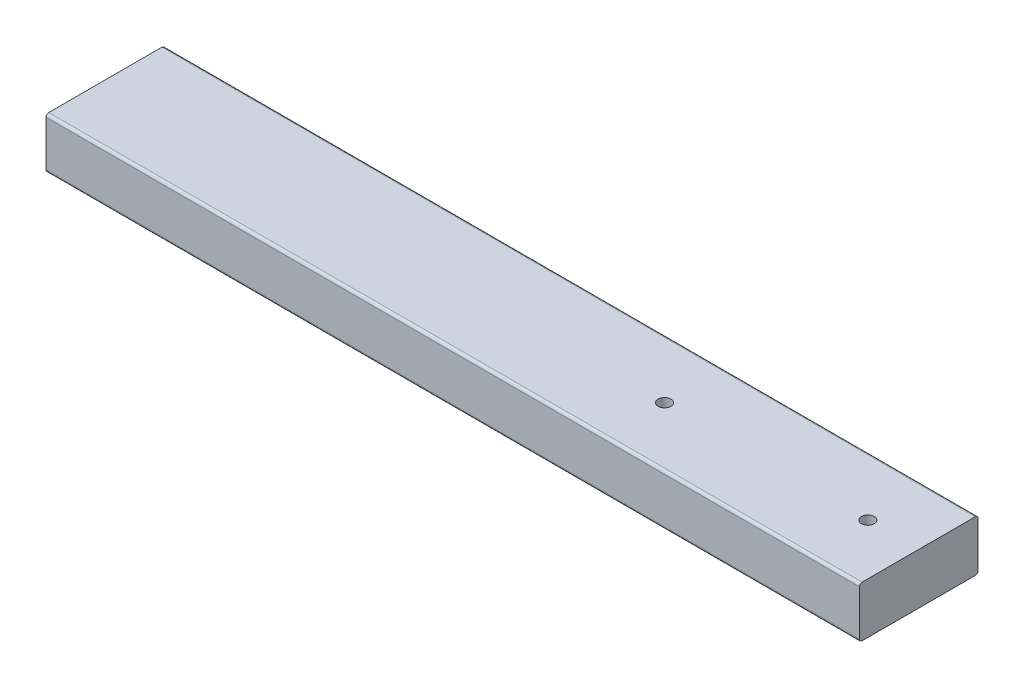
ISO-10303-21;
HEADER;
FILE_DESCRIPTION(('STEP AP214'),'2;1');
FILE_NAME('part.step','',(''),(''),'','','');
FILE_SCHEMA(('AUTOMOTIVE_DESIGN { 1 0 10303 214 1 1 1 1 }'));
ENDSEC;
DATA;
#1=APPLICATION_CONTEXT('core data for automotive mechanical design processes');
#2=APPLICATION_PROTOCOL_DEFINITION('international standard','automotive_design',2000,#1);
#3=PRODUCT_CONTEXT('',#1,'mechanical');
#4=PRODUCT('Part','Part','',(#3));
#5=PRODUCT_RELATED_PRODUCT_CATEGORY('part','',(#4));
#6=PRODUCT_DEFINITION_FORMATION('','',#4);
#7=PRODUCT_DEFINITION_CONTEXT('part definition',#1,'design');
#8=PRODUCT_DEFINITION('design','',#6,#7);
#9=PRODUCT_DEFINITION_SHAPE('','',#8);
#10=(LENGTH_UNIT() NAMED_UNIT(*) SI_UNIT(.MILLI.,.METRE.));
#11=(NAMED_UNIT(*) PLANE_ANGLE_UNIT() SI_UNIT($,.RADIAN.));
#12=(NAMED_UNIT(*) SI_UNIT($,.STERADIAN.) SOLID_ANGLE_UNIT());
#13=UNCERTAINTY_MEASURE_WITH_UNIT(LENGTH_MEASURE(1.E-05),#10,'distance_accuracy_value','');
#14=(GEOMETRIC_REPRESENTATION_CONTEXT(3) GLOBAL_UNCERTAINTY_ASSIGNED_CONTEXT((#13)) GLOBAL_UNIT_ASSIGNED_CONTEXT((#10,
#11,#12)) REPRESENTATION_CONTEXT('',''));
#15=CARTESIAN_POINT('',(0.,0.,0.));
#16=DIRECTION('',(0.,0.,1.));
#17=DIRECTION('',(1.,0.,0.));
#18=AXIS2_PLACEMENT_3D('',#15,#16,#17);
#19=CARTESIAN_POINT('',(609.6,-19.05,-44.45));
#20=DIRECTION('',(0.,0.,1.));
#21=DIRECTION('',(1.,0.,0.));
#22=AXIS2_PLACEMENT_3D('',#19,#20,#21);
#23=PLANE('',#22);
#24=DIRECTION('',(0.,1.,0.));
#25=VECTOR('',#24,1.);
#26=CARTESIAN_POINT('',(0.,-19.05,-44.45));
#27=LINE('',#26,#25);
#28=CARTESIAN_POINT('',(0.,-17.05,-44.45));
#29=VERTEX_POINT('',#28);
#30=CARTESIAN_POINT('',(0.,17.05,-44.45));
#31=VERTEX_POINT('',#30);
#32=EDGE_CURVE('E130',#29,#31,#27,.T.);
#33=ORIENTED_EDGE('',*,*,#32,.T.);
#34=DIRECTION('',(-1.,0.,0.));
#35=VECTOR('',#34,1.);
#36=CARTESIAN_POINT('',(609.6,17.05,-44.45));
#37=LINE('',#36,#35);
#38=CARTESIAN_POINT('',(609.6,17.05,-44.45));
#39=VERTEX_POINT('',#38);
#40=EDGE_CURVE('E153',#31,#39,#37,.F.);
#41=ORIENTED_EDGE('',*,*,#40,.T.);
#42=DIRECTION('',(0.,1.,0.));
#43=VECTOR('',#42,1.);
#44=CARTESIAN_POINT('',(609.6,-19.05,-44.45));
#45=LINE('',#44,#43);
#46=CARTESIAN_POINT('',(609.6,-17.05,-44.45));
#47=VERTEX_POINT('',#46);
#48=EDGE_CURVE('E128',#47,#39,#45,.T.);
#49=ORIENTED_EDGE('',*,*,#48,.F.);
#50=DIRECTION('',(-1.,0.,0.));
#51=VECTOR('',#50,1.);
#52=CARTESIAN_POINT('',(609.6,-17.05,-44.45));
#53=LINE('',#52,#51);
#54=EDGE_CURVE('E150',#47,#29,#53,.T.);
#55=ORIENTED_EDGE('',*,*,#54,.T.);
#56=EDGE_LOOP('',(#33,#41,#49,#55));
#57=FACE_BOUND('',#56,.T.);
#58=ADVANCED_FACE('F35',(#57),#23,.F.);
#59=CARTESIAN_POINT('',(609.6,19.05,44.45));
#60=DIRECTION('',(0.,-1.,0.));
#61=DIRECTION('',(0.,0.,-1.));
#62=AXIS2_PLACEMENT_3D('',#59,#60,#61);
#63=PLANE('',#62);
#64=CARTESIAN_POINT('',(571.5,19.05,0.));
#65=DIRECTION('',(0.,-1.,0.));
#66=DIRECTION('',(0.,0.,-1.));
#67=AXIS2_PLACEMENT_3D('',#64,#65,#66);
#68=CIRCLE('',#67,4.76250000000001);
#69=CARTESIAN_POINT('',(571.5,19.05,-4.76250000000001));
#70=VERTEX_POINT('',#69);
#71=EDGE_CURVE('E183',#70,#70,#68,.T.);
#72=ORIENTED_EDGE('',*,*,#71,.T.);
#73=EDGE_LOOP('',(#72));
#74=FACE_BOUND('',#73,.T.);
#75=CARTESIAN_POINT('',(419.1,19.05,0.));
#76=DIRECTION('',(0.,-1.,0.));
#77=DIRECTION('',(0.,0.,-1.));
#78=AXIS2_PLACEMENT_3D('',#75,#76,#77);
#79=CIRCLE('',#78,4.76250000000001);
#80=CARTESIAN_POINT('',(419.1,19.05,-4.76250000000001));
#81=VERTEX_POINT('',#80);
#82=EDGE_CURVE('E178',#81,#81,#79,.T.);
#83=ORIENTED_EDGE('',*,*,#82,.T.);
#84=EDGE_LOOP('',(#83));
#85=FACE_BOUND('',#84,.T.);
#86=DIRECTION('',(0.,0.,1.));
#87=VECTOR('',#86,1.);
#88=CARTESIAN_POINT('',(0.,19.05,44.45));
#89=LINE('',#88,#87);
#90=CARTESIAN_POINT('',(0.,19.05,-42.45));
#91=VERTEX_POINT('',#90);
#92=CARTESIAN_POINT('',(0.,19.05,42.45));
#93=VERTEX_POINT('',#92);
#94=EDGE_CURVE('E126',#91,#93,#89,.T.);
#95=ORIENTED_EDGE('',*,*,#94,.T.);
#96=DIRECTION('',(-1.,0.,0.));
#97=VECTOR('',#96,1.);
#98=CARTESIAN_POINT('',(609.6,19.05,42.45));
#99=LINE('',#98,#97);
#100=CARTESIAN_POINT('',(609.6,19.05,42.45));
#101=VERTEX_POINT('',#100);
#102=EDGE_CURVE('E105',#93,#101,#99,.F.);
#103=ORIENTED_EDGE('',*,*,#102,.T.);
#104=DIRECTION('',(0.,0.,1.));
#105=VECTOR('',#104,1.);
#106=CARTESIAN_POINT('',(609.6,19.05,44.45));
#107=LINE('',#106,#105);
#108=CARTESIAN_POINT('',(609.6,19.05,-42.45));
#109=VERTEX_POINT('',#108);
#110=EDGE_CURVE('E169',#109,#101,#107,.T.);
#111=ORIENTED_EDGE('',*,*,#110,.F.);
#112=DIRECTION('',(-1.,0.,0.));
#113=VECTOR('',#112,1.);
#114=CARTESIAN_POINT('',(609.6,19.05,-42.45));
#115=LINE('',#114,#113);
#116=EDGE_CURVE('E110',#109,#91,#115,.T.);
#117=ORIENTED_EDGE('',*,*,#116,.T.);
#118=EDGE_LOOP('',(#95,#103,#111,#117));
#119=FACE_BOUND('',#118,.T.);
#120=ADVANCED_FACE('F191',(#74,#85,#119),#63,.F.);
#121=CARTESIAN_POINT('',(609.6,-19.05,44.45));
#122=DIRECTION('',(0.,0.,-1.));
#123=DIRECTION('',(-1.,0.,0.));
#124=AXIS2_PLACEMENT_3D('',#121,#122,#123);
#125=PLANE('',#124);
#126=DIRECTION('',(0.,-1.,0.));
#127=VECTOR('',#126,1.);
#128=CARTESIAN_POINT('',(609.6,-19.05,44.45));
#129=LINE('',#128,#127);
#130=CARTESIAN_POINT('',(609.6,17.05,44.45));
#131=VERTEX_POINT('',#130);
#132=CARTESIAN_POINT('',(609.6,-17.05,44.45));
#133=VERTEX_POINT('',#132);
#134=EDGE_CURVE('E119',#131,#133,#129,.T.);
#135=ORIENTED_EDGE('',*,*,#134,.F.);
#136=DIRECTION('',(-1.,0.,0.));
#137=VECTOR('',#136,1.);
#138=CARTESIAN_POINT('',(609.6,17.05,44.45));
#139=LINE('',#138,#137);
#140=CARTESIAN_POINT('',(0.,17.05,44.45));
#141=VERTEX_POINT('',#140);
#142=EDGE_CURVE('E104',#131,#141,#139,.T.);
#143=ORIENTED_EDGE('',*,*,#142,.T.);
#144=DIRECTION('',(0.,-1.,0.));
#145=VECTOR('',#144,1.);
#146=CARTESIAN_POINT('',(0.,-19.05,44.45));
#147=LINE('',#146,#145);
#148=CARTESIAN_POINT('',(0.,-17.05,44.45));
#149=VERTEX_POINT('',#148);
#150=EDGE_CURVE('E117',#141,#149,#147,.T.);
#151=ORIENTED_EDGE('',*,*,#150,.T.);
#152=DIRECTION('',(-1.,0.,0.));
#153=VECTOR('',#152,1.);
#154=CARTESIAN_POINT('',(609.6,-17.05,44.45));
#155=LINE('',#154,#153);
#156=EDGE_CURVE('E121',#149,#133,#155,.F.);
#157=ORIENTED_EDGE('',*,*,#156,.T.);
#158=EDGE_LOOP('',(#135,#143,#151,#157));
#159=FACE_BOUND('',#158,.T.);
#160=ADVANCED_FACE('F116',(#159),#125,.F.);
#161=CARTESIAN_POINT('',(609.6,-19.05,44.45));
#162=DIRECTION('',(0.,1.,0.));
#163=DIRECTION('',(0.,0.,1.));
#164=AXIS2_PLACEMENT_3D('',#161,#162,#163);
#165=PLANE('',#164);
#166=CARTESIAN_POINT('',(571.5,-19.05,0.));
#167=DIRECTION('',(0.,-1.,0.));
#168=DIRECTION('',(0.,0.,-1.));
#169=AXIS2_PLACEMENT_3D('',#166,#167,#168);
#170=CIRCLE('',#169,4.76250000000001);
#171=CARTESIAN_POINT('',(571.5,-19.05,-4.76250000000001));
#172=VERTEX_POINT('',#171);
#173=EDGE_CURVE('E185',#172,#172,#170,.T.);
#174=ORIENTED_EDGE('',*,*,#173,.F.);
#175=EDGE_LOOP('',(#174));
#176=FACE_BOUND('',#175,.T.);
#177=CARTESIAN_POINT('',(419.1,-19.05,0.));
#178=DIRECTION('',(0.,-1.,0.));
#179=DIRECTION('',(0.,0.,-1.));
#180=AXIS2_PLACEMENT_3D('',#177,#178,#179);
#181=CIRCLE('',#180,4.76250000000001);
#182=CARTESIAN_POINT('',(419.1,-19.05,-4.76250000000001));
#183=VERTEX_POINT('',#182);
#184=EDGE_CURVE('E174',#183,#183,#181,.T.);
#185=ORIENTED_EDGE('',*,*,#184,.F.);
#186=EDGE_LOOP('',(#185));
#187=FACE_BOUND('',#186,.T.);
#188=DIRECTION('',(0.,0.,-1.));
#189=VECTOR('',#188,1.);
#190=CARTESIAN_POINT('',(0.,-19.05,44.45));
#191=LINE('',#190,#189);
#192=CARTESIAN_POINT('',(0.,-19.05,42.45));
#193=VERTEX_POINT('',#192);
#194=CARTESIAN_POINT('',(0.,-19.05,-42.45));
#195=VERTEX_POINT('',#194);
#196=EDGE_CURVE('E125',#193,#195,#191,.T.);
#197=ORIENTED_EDGE('',*,*,#196,.T.);
#198=DIRECTION('',(-1.,0.,0.));
#199=VECTOR('',#198,1.);
#200=CARTESIAN_POINT('',(609.6,-19.05,-42.45));
#201=LINE('',#200,#199);
#202=CARTESIAN_POINT('',(609.6,-19.05,-42.45));
#203=VERTEX_POINT('',#202);
#204=EDGE_CURVE('E11',#195,#203,#201,.F.);
#205=ORIENTED_EDGE('',*,*,#204,.T.);
#206=DIRECTION('',(0.,0.,-1.));
#207=VECTOR('',#206,1.);
#208=CARTESIAN_POINT('',(609.6,-19.05,44.45));
#209=LINE('',#208,#207);
#210=CARTESIAN_POINT('',(609.6,-19.05,42.45));
#211=VERTEX_POINT('',#210);
#212=EDGE_CURVE('E134',#211,#203,#209,.T.);
#213=ORIENTED_EDGE('',*,*,#212,.F.);
#214=DIRECTION('',(-1.,0.,0.));
#215=VECTOR('',#214,1.);
#216=CARTESIAN_POINT('',(609.6,-19.05,42.45));
#217=LINE('',#216,#215);
#218=EDGE_CURVE('E43',#211,#193,#217,.T.);
#219=ORIENTED_EDGE('',*,*,#218,.T.);
#220=EDGE_LOOP('',(#197,#205,#213,#219));
#221=FACE_BOUND('',#220,.T.);
#222=ADVANCED_FACE('F156',(#176,#187,#221),#165,.F.);
#223=CARTESIAN_POINT('',(609.6,0.,0.));
#224=DIRECTION('',(-1.,0.,0.));
#225=DIRECTION('',(0.,0.,1.));
#226=AXIS2_PLACEMENT_3D('',#223,#224,#225);
#227=PLANE('',#226);
#228=ORIENTED_EDGE('',*,*,#110,.T.);
#229=CARTESIAN_POINT('',(609.6,17.05,42.45));
#230=DIRECTION('',(-1.,0.,0.));
#231=DIRECTION('',(0.,0.,1.));
#232=AXIS2_PLACEMENT_3D('',#229,#230,#231);
#233=CIRCLE('',#232,2.);
#234=EDGE_CURVE('E148',#101,#131,#233,.F.);
#235=ORIENTED_EDGE('',*,*,#234,.T.);
#236=ORIENTED_EDGE('',*,*,#134,.T.);
#237=CARTESIAN_POINT('',(609.6,-17.05,42.45));
#238=DIRECTION('',(-1.,0.,0.));
#239=DIRECTION('',(0.,0.,1.));
#240=AXIS2_PLACEMENT_3D('',#237,#238,#239);
#241=CIRCLE('',#240,2.);
#242=EDGE_CURVE('E55',#133,#211,#241,.F.);
#243=ORIENTED_EDGE('',*,*,#242,.T.);
#244=ORIENTED_EDGE('',*,*,#212,.T.);
#245=CARTESIAN_POINT('',(609.6,-17.05,-42.45));
#246=DIRECTION('',(-1.,0.,0.));
#247=DIRECTION('',(0.,0.,1.));
#248=AXIS2_PLACEMENT_3D('',#245,#246,#247);
#249=CIRCLE('',#248,2.);
#250=EDGE_CURVE('E144',#203,#47,#249,.F.);
#251=ORIENTED_EDGE('',*,*,#250,.T.);
#252=ORIENTED_EDGE('',*,*,#48,.T.);
#253=CARTESIAN_POINT('',(609.6,17.05,-42.45));
#254=DIRECTION('',(-1.,0.,0.));
#255=DIRECTION('',(0.,0.,1.));
#256=AXIS2_PLACEMENT_3D('',#253,#254,#255);
#257=CIRCLE('',#256,2.);
#258=EDGE_CURVE('E146',#39,#109,#257,.F.);
#259=ORIENTED_EDGE('',*,*,#258,.T.);
#260=EDGE_LOOP('',(#228,#235,#236,#243,#244,#251,#252,#259));
#261=FACE_BOUND('',#260,.T.);
#262=ADVANCED_FACE('F202',(#261),#227,.F.);
#263=CARTESIAN_POINT('',(0.,0.,0.));
#264=DIRECTION('',(-1.,0.,0.));
#265=DIRECTION('',(0.,0.,1.));
#266=AXIS2_PLACEMENT_3D('',#263,#264,#265);
#267=PLANE('',#266);
#268=ORIENTED_EDGE('',*,*,#150,.F.);
#269=CARTESIAN_POINT('',(0.,17.05,42.45));
#270=DIRECTION('',(-1.,0.,0.));
#271=DIRECTION('',(0.,0.,1.));
#272=AXIS2_PLACEMENT_3D('',#269,#270,#271);
#273=CIRCLE('',#272,2.);
#274=EDGE_CURVE('E100',#141,#93,#273,.T.);
#275=ORIENTED_EDGE('',*,*,#274,.T.);
#276=ORIENTED_EDGE('',*,*,#94,.F.);
#277=CARTESIAN_POINT('',(0.,17.05,-42.45));
#278=DIRECTION('',(-1.,0.,0.));
#279=DIRECTION('',(0.,0.,1.));
#280=AXIS2_PLACEMENT_3D('',#277,#278,#279);
#281=CIRCLE('',#280,2.);
#282=EDGE_CURVE('E111',#91,#31,#281,.T.);
#283=ORIENTED_EDGE('',*,*,#282,.T.);
#284=ORIENTED_EDGE('',*,*,#32,.F.);
#285=CARTESIAN_POINT('',(0.,-17.05,-42.45));
#286=DIRECTION('',(-1.,0.,0.));
#287=DIRECTION('',(0.,0.,1.));
#288=AXIS2_PLACEMENT_3D('',#285,#286,#287);
#289=CIRCLE('',#288,2.);
#290=EDGE_CURVE('E137',#29,#195,#289,.T.);
#291=ORIENTED_EDGE('',*,*,#290,.T.);
#292=ORIENTED_EDGE('',*,*,#196,.F.);
#293=CARTESIAN_POINT('',(0.,-17.05,42.45));
#294=DIRECTION('',(-1.,0.,0.));
#295=DIRECTION('',(0.,0.,1.));
#296=AXIS2_PLACEMENT_3D('',#293,#294,#295);
#297=CIRCLE('',#296,2.);
#298=EDGE_CURVE('E120',#193,#149,#297,.T.);
#299=ORIENTED_EDGE('',*,*,#298,.T.);
#300=EDGE_LOOP('',(#268,#275,#276,#283,#284,#291,#292,#299));
#301=FACE_BOUND('',#300,.T.);
#302=ADVANCED_FACE('F123',(#301),#267,.T.);
#303=CARTESIAN_POINT('',(609.6,17.05,42.45));
#304=DIRECTION('',(-1.,0.,0.));
#305=DIRECTION('',(0.,0.,1.));
#306=AXIS2_PLACEMENT_3D('',#303,#304,#305);
#307=CYLINDRICAL_SURFACE('',#306,2.);
#308=ORIENTED_EDGE('',*,*,#234,.F.);
#309=ORIENTED_EDGE('',*,*,#102,.F.);
#310=ORIENTED_EDGE('',*,*,#274,.F.);
#311=ORIENTED_EDGE('',*,*,#142,.F.);
#312=EDGE_LOOP('',(#308,#309,#310,#311));
#313=FACE_BOUND('',#312,.T.);
#314=ADVANCED_FACE('F103',(#313),#307,.T.);
#315=CARTESIAN_POINT('',(609.6,17.05,-42.45));
#316=DIRECTION('',(-1.,0.,0.));
#317=DIRECTION('',(0.,0.,1.));
#318=AXIS2_PLACEMENT_3D('',#315,#316,#317);
#319=CYLINDRICAL_SURFACE('',#318,2.);
#320=ORIENTED_EDGE('',*,*,#258,.F.);
#321=ORIENTED_EDGE('',*,*,#40,.F.);
#322=ORIENTED_EDGE('',*,*,#282,.F.);
#323=ORIENTED_EDGE('',*,*,#116,.F.);
#324=EDGE_LOOP('',(#320,#321,#322,#323));
#325=FACE_BOUND('',#324,.T.);
#326=ADVANCED_FACE('F223',(#325),#319,.T.);
#327=CARTESIAN_POINT('',(609.6,-17.05,-42.45));
#328=DIRECTION('',(-1.,0.,0.));
#329=DIRECTION('',(0.,0.,1.));
#330=AXIS2_PLACEMENT_3D('',#327,#328,#329);
#331=CYLINDRICAL_SURFACE('',#330,2.);
#332=ORIENTED_EDGE('',*,*,#250,.F.);
#333=ORIENTED_EDGE('',*,*,#204,.F.);
#334=ORIENTED_EDGE('',*,*,#290,.F.);
#335=ORIENTED_EDGE('',*,*,#54,.F.);
#336=EDGE_LOOP('',(#332,#333,#334,#335));
#337=FACE_BOUND('',#336,.T.);
#338=ADVANCED_FACE('F163',(#337),#331,.T.);
#339=CARTESIAN_POINT('',(609.6,-17.05,42.45));
#340=DIRECTION('',(-1.,0.,0.));
#341=DIRECTION('',(0.,0.,1.));
#342=AXIS2_PLACEMENT_3D('',#339,#340,#341);
#343=CYLINDRICAL_SURFACE('',#342,2.);
#344=ORIENTED_EDGE('',*,*,#242,.F.);
#345=ORIENTED_EDGE('',*,*,#156,.F.);
#346=ORIENTED_EDGE('',*,*,#298,.F.);
#347=ORIENTED_EDGE('',*,*,#218,.F.);
#348=EDGE_LOOP('',(#344,#345,#346,#347));
#349=FACE_BOUND('',#348,.T.);
#350=ADVANCED_FACE('F37',(#349),#343,.T.);
#351=CARTESIAN_POINT('',(419.1,19.05,0.));
#352=DIRECTION('',(0.,-1.,0.));
#353=DIRECTION('',(0.,0.,-1.));
#354=AXIS2_PLACEMENT_3D('',#351,#352,#353);
#355=CYLINDRICAL_SURFACE('',#354,4.76250000000001);
#356=ORIENTED_EDGE('',*,*,#82,.F.);
#357=EDGE_LOOP('',(#356));
#358=FACE_BOUND('',#357,.T.);
#359=ORIENTED_EDGE('',*,*,#184,.T.);
#360=EDGE_LOOP('',(#359));
#361=FACE_BOUND('',#360,.T.);
#362=ADVANCED_FACE('F196',(#358,#361),#355,.F.);
#363=CARTESIAN_POINT('',(571.5,19.05,0.));
#364=DIRECTION('',(0.,-1.,0.));
#365=DIRECTION('',(0.,0.,-1.));
#366=AXIS2_PLACEMENT_3D('',#363,#364,#365);
#367=CYLINDRICAL_SURFACE('',#366,4.76250000000001);
#368=ORIENTED_EDGE('',*,*,#71,.F.);
#369=EDGE_LOOP('',(#368));
#370=FACE_BOUND('',#369,.T.);
#371=ORIENTED_EDGE('',*,*,#173,.T.);
#372=EDGE_LOOP('',(#371));
#373=FACE_BOUND('',#372,.T.);
#374=ADVANCED_FACE('F193',(#370,#373),#367,.F.);
#375=CLOSED_SHELL('',(#58,#120,#160,#222,#262,#302,#314,#326,#338,#350,#362,#374));
#376=MANIFOLD_SOLID_BREP('B2',#375);
#377=ADVANCED_BREP_SHAPE_REPRESENTATION('',(#18,#376),#14);
#378=SHAPE_DEFINITION_REPRESENTATION(#9,#377);
ENDSEC;
END-ISO-10303-21;
